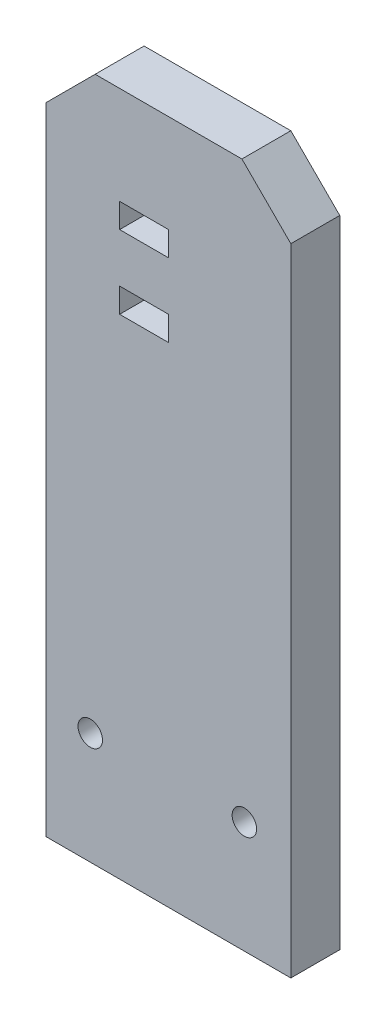
ISO-10303-21;
HEADER;
FILE_DESCRIPTION(('STEP AP214'),'2;1');
FILE_NAME('part.step','',(''),(''),'','','');
FILE_SCHEMA(('AUTOMOTIVE_DESIGN { 1 0 10303 214 1 1 1 1 }'));
ENDSEC;
DATA;
#1=APPLICATION_CONTEXT('core data for automotive mechanical design processes');
#2=APPLICATION_PROTOCOL_DEFINITION('international standard','automotive_design',2000,#1);
#3=PRODUCT_CONTEXT('',#1,'mechanical');
#4=PRODUCT('Part','Part','',(#3));
#5=PRODUCT_RELATED_PRODUCT_CATEGORY('part','',(#4));
#6=PRODUCT_DEFINITION_FORMATION('','',#4);
#7=PRODUCT_DEFINITION_CONTEXT('part definition',#1,'design');
#8=PRODUCT_DEFINITION('design','',#6,#7);
#9=PRODUCT_DEFINITION_SHAPE('','',#8);
#10=(LENGTH_UNIT() NAMED_UNIT(*) SI_UNIT(.MILLI.,.METRE.));
#11=(NAMED_UNIT(*) PLANE_ANGLE_UNIT() SI_UNIT($,.RADIAN.));
#12=(NAMED_UNIT(*) SI_UNIT($,.STERADIAN.) SOLID_ANGLE_UNIT());
#13=UNCERTAINTY_MEASURE_WITH_UNIT(LENGTH_MEASURE(1.E-05),#10,'distance_accuracy_value','');
#14=(GEOMETRIC_REPRESENTATION_CONTEXT(3) GLOBAL_UNCERTAINTY_ASSIGNED_CONTEXT((#13)) GLOBAL_UNIT_ASSIGNED_CONTEXT((#10,
#11,#12)) REPRESENTATION_CONTEXT('',''));
#15=CARTESIAN_POINT('',(0.,0.,0.));
#16=DIRECTION('',(0.,0.,1.));
#17=DIRECTION('',(1.,0.,0.));
#18=AXIS2_PLACEMENT_3D('',#15,#16,#17);
#19=CARTESIAN_POINT('',(0.,0.,5.));
#20=DIRECTION('',(0.,0.,1.));
#21=DIRECTION('',(1.,0.,0.));
#22=AXIS2_PLACEMENT_3D('',#19,#20,#21);
#23=PLANE('',#22);
#24=CARTESIAN_POINT('',(-16.,22.85,5.));
#25=DIRECTION('',(0.,0.,1.));
#26=DIRECTION('',(1.,0.,0.));
#27=AXIS2_PLACEMENT_3D('',#24,#25,#26);
#28=CIRCLE('',#27,2.5);
#29=CARTESIAN_POINT('',(-13.5,22.85,5.));
#30=VERTEX_POINT('',#29);
#31=EDGE_CURVE('E190',#30,#30,#28,.T.);
#32=ORIENTED_EDGE('',*,*,#31,.F.);
#33=EDGE_LOOP('',(#32));
#34=FACE_BOUND('',#33,.T.);
#35=DIRECTION('',(-1.,0.,0.));
#36=VECTOR('',#35,1.);
#37=CARTESIAN_POINT('',(-25.,140.,5.));
#38=LINE('',#37,#36);
#39=CARTESIAN_POINT('',(15.,140.,5.));
#40=VERTEX_POINT('',#39);
#41=CARTESIAN_POINT('',(-15.,140.,5.));
#42=VERTEX_POINT('',#41);
#43=EDGE_CURVE('E250',#40,#42,#38,.T.);
#44=ORIENTED_EDGE('',*,*,#43,.T.);
#45=DIRECTION('',(0.707106781186548,0.707106781186547,0.));
#46=VECTOR('',#45,1.);
#47=CARTESIAN_POINT('',(-77.5,77.5000000000001,5.));
#48=LINE('',#47,#46);
#49=CARTESIAN_POINT('',(-25.,130.,5.));
#50=VERTEX_POINT('',#49);
#51=EDGE_CURVE('E55',#42,#50,#48,.F.);
#52=ORIENTED_EDGE('',*,*,#51,.T.);
#53=DIRECTION('',(0.,-1.,0.));
#54=VECTOR('',#53,1.);
#55=CARTESIAN_POINT('',(-25.,0.,5.));
#56=LINE('',#55,#54);
#57=CARTESIAN_POINT('',(-25.,0.,5.));
#58=VERTEX_POINT('',#57);
#59=EDGE_CURVE('E253',#50,#58,#56,.T.);
#60=ORIENTED_EDGE('',*,*,#59,.T.);
#61=DIRECTION('',(1.,0.,0.));
#62=VECTOR('',#61,1.);
#63=CARTESIAN_POINT('',(25.,0.,5.));
#64=LINE('',#63,#62);
#65=CARTESIAN_POINT('',(25.,0.,5.));
#66=VERTEX_POINT('',#65);
#67=EDGE_CURVE('E257',#58,#66,#64,.T.);
#68=ORIENTED_EDGE('',*,*,#67,.T.);
#69=DIRECTION('',(0.,1.,0.));
#70=VECTOR('',#69,1.);
#71=CARTESIAN_POINT('',(25.,0.,5.));
#72=LINE('',#71,#70);
#73=CARTESIAN_POINT('',(25.,130.,5.));
#74=VERTEX_POINT('',#73);
#75=EDGE_CURVE('E260',#66,#74,#72,.T.);
#76=ORIENTED_EDGE('',*,*,#75,.T.);
#77=DIRECTION('',(0.707106781186547,-0.707106781186549,0.));
#78=VECTOR('',#77,1.);
#79=CARTESIAN_POINT('',(77.5,77.4999999999998,5.));
#80=LINE('',#79,#78);
#81=EDGE_CURVE('E297',#74,#40,#80,.F.);
#82=ORIENTED_EDGE('',*,*,#81,.T.);
#83=EDGE_LOOP('',(#44,#52,#60,#68,#76,#82));
#84=FACE_BOUND('',#83,.T.);
#85=DIRECTION('',(-1.,0.,0.));
#86=VECTOR('',#85,1.);
#87=CARTESIAN_POINT('',(0.,105.,5.));
#88=LINE('',#87,#86);
#89=CARTESIAN_POINT('',(0.,105.,5.));
#90=VERTEX_POINT('',#89);
#91=CARTESIAN_POINT('',(-10.,105.,5.));
#92=VERTEX_POINT('',#91);
#93=EDGE_CURVE('E210',#90,#92,#88,.T.);
#94=ORIENTED_EDGE('',*,*,#93,.F.);
#95=DIRECTION('',(0.,1.,0.));
#96=VECTOR('',#95,1.);
#97=CARTESIAN_POINT('',(0.,100.,5.));
#98=LINE('',#97,#96);
#99=CARTESIAN_POINT('',(0.,100.,5.));
#100=VERTEX_POINT('',#99);
#101=EDGE_CURVE('E207',#100,#90,#98,.T.);
#102=ORIENTED_EDGE('',*,*,#101,.F.);
#103=DIRECTION('',(1.,0.,0.));
#104=VECTOR('',#103,1.);
#105=CARTESIAN_POINT('',(0.,100.,5.));
#106=LINE('',#105,#104);
#107=CARTESIAN_POINT('',(-10.,100.,5.));
#108=VERTEX_POINT('',#107);
#109=EDGE_CURVE('E218',#108,#100,#106,.T.);
#110=ORIENTED_EDGE('',*,*,#109,.F.);
#111=DIRECTION('',(0.,-1.,0.));
#112=VECTOR('',#111,1.);
#113=CARTESIAN_POINT('',(-10.,100.,5.));
#114=LINE('',#113,#112);
#115=EDGE_CURVE('E214',#92,#108,#114,.T.);
#116=ORIENTED_EDGE('',*,*,#115,.F.);
#117=EDGE_LOOP('',(#94,#102,#110,#116));
#118=FACE_BOUND('',#117,.T.);
#119=DIRECTION('',(-1.,0.,0.));
#120=VECTOR('',#119,1.);
#121=CARTESIAN_POINT('',(0.,120.,5.));
#122=LINE('',#121,#120);
#123=CARTESIAN_POINT('',(0.,120.,5.));
#124=VERTEX_POINT('',#123);
#125=CARTESIAN_POINT('',(-10.,120.,5.));
#126=VERTEX_POINT('',#125);
#127=EDGE_CURVE('E162',#124,#126,#122,.T.);
#128=ORIENTED_EDGE('',*,*,#127,.F.);
#129=DIRECTION('',(0.,1.,0.));
#130=VECTOR('',#129,1.);
#131=CARTESIAN_POINT('',(0.,115.,5.));
#132=LINE('',#131,#130);
#133=CARTESIAN_POINT('',(0.,115.,5.));
#134=VERTEX_POINT('',#133);
#135=EDGE_CURVE('E151',#134,#124,#132,.T.);
#136=ORIENTED_EDGE('',*,*,#135,.F.);
#137=DIRECTION('',(1.,0.,0.));
#138=VECTOR('',#137,1.);
#139=CARTESIAN_POINT('',(0.,115.,5.));
#140=LINE('',#139,#138);
#141=CARTESIAN_POINT('',(-10.,115.,5.));
#142=VERTEX_POINT('',#141);
#143=EDGE_CURVE('E181',#142,#134,#140,.T.);
#144=ORIENTED_EDGE('',*,*,#143,.F.);
#145=DIRECTION('',(0.,-1.,0.));
#146=VECTOR('',#145,1.);
#147=CARTESIAN_POINT('',(-10.,115.,5.));
#148=LINE('',#147,#146);
#149=EDGE_CURVE('E177',#126,#142,#148,.T.);
#150=ORIENTED_EDGE('',*,*,#149,.F.);
#151=EDGE_LOOP('',(#128,#136,#144,#150));
#152=FACE_BOUND('',#151,.T.);
#153=CARTESIAN_POINT('',(15.5,22.85,5.));
#154=DIRECTION('',(0.,0.,1.));
#155=DIRECTION('',(1.,0.,0.));
#156=AXIS2_PLACEMENT_3D('',#153,#154,#155);
#157=CIRCLE('',#156,2.5);
#158=CARTESIAN_POINT('',(18.,22.85,5.));
#159=VERTEX_POINT('',#158);
#160=EDGE_CURVE('E385',#159,#159,#157,.T.);
#161=ORIENTED_EDGE('',*,*,#160,.F.);
#162=EDGE_LOOP('',(#161));
#163=FACE_BOUND('',#162,.T.);
#164=ADVANCED_FACE('F45',(#34,#84,#118,#152,#163),#23,.T.);
#165=CARTESIAN_POINT('',(0.,0.,-5.));
#166=DIRECTION('',(0.,0.,1.));
#167=DIRECTION('',(1.,0.,0.));
#168=AXIS2_PLACEMENT_3D('',#165,#166,#167);
#169=PLANE('',#168);
#170=DIRECTION('',(0.,1.,0.));
#171=VECTOR('',#170,1.);
#172=CARTESIAN_POINT('',(0.,100.,-5.));
#173=LINE('',#172,#171);
#174=CARTESIAN_POINT('',(0.,100.,-5.));
#175=VERTEX_POINT('',#174);
#176=CARTESIAN_POINT('',(0.,105.,-5.));
#177=VERTEX_POINT('',#176);
#178=EDGE_CURVE('E171',#175,#177,#173,.T.);
#179=ORIENTED_EDGE('',*,*,#178,.T.);
#180=DIRECTION('',(-1.,0.,0.));
#181=VECTOR('',#180,1.);
#182=CARTESIAN_POINT('',(0.,105.,-5.));
#183=LINE('',#182,#181);
#184=CARTESIAN_POINT('',(-10.,105.,-5.));
#185=VERTEX_POINT('',#184);
#186=EDGE_CURVE('E225',#177,#185,#183,.T.);
#187=ORIENTED_EDGE('',*,*,#186,.T.);
#188=DIRECTION('',(0.,-1.,0.));
#189=VECTOR('',#188,1.);
#190=CARTESIAN_POINT('',(-10.,100.,-5.));
#191=LINE('',#190,#189);
#192=CARTESIAN_POINT('',(-10.,100.,-5.));
#193=VERTEX_POINT('',#192);
#194=EDGE_CURVE('E229',#185,#193,#191,.T.);
#195=ORIENTED_EDGE('',*,*,#194,.T.);
#196=DIRECTION('',(1.,0.,0.));
#197=VECTOR('',#196,1.);
#198=CARTESIAN_POINT('',(0.,100.,-5.));
#199=LINE('',#198,#197);
#200=EDGE_CURVE('E211',#193,#175,#199,.T.);
#201=ORIENTED_EDGE('',*,*,#200,.T.);
#202=EDGE_LOOP('',(#179,#187,#195,#201));
#203=FACE_BOUND('',#202,.T.);
#204=DIRECTION('',(0.,-1.,0.));
#205=VECTOR('',#204,1.);
#206=CARTESIAN_POINT('',(-25.,0.,-5.));
#207=LINE('',#206,#205);
#208=CARTESIAN_POINT('',(-25.,130.,-5.));
#209=VERTEX_POINT('',#208);
#210=CARTESIAN_POINT('',(-25.,0.,-5.));
#211=VERTEX_POINT('',#210);
#212=EDGE_CURVE('E266',#209,#211,#207,.T.);
#213=ORIENTED_EDGE('',*,*,#212,.F.);
#214=DIRECTION('',(-0.707106781186548,-0.707106781186547,0.));
#215=VECTOR('',#214,1.);
#216=CARTESIAN_POINT('',(-25.,130.,-5.));
#217=LINE('',#216,#215);
#218=CARTESIAN_POINT('',(-15.,140.,-5.));
#219=VERTEX_POINT('',#218);
#220=EDGE_CURVE('E288',#209,#219,#217,.F.);
#221=ORIENTED_EDGE('',*,*,#220,.T.);
#222=DIRECTION('',(-1.,0.,0.));
#223=VECTOR('',#222,1.);
#224=CARTESIAN_POINT('',(-25.,140.,-5.));
#225=LINE('',#224,#223);
#226=CARTESIAN_POINT('',(15.,140.,-5.));
#227=VERTEX_POINT('',#226);
#228=EDGE_CURVE('E249',#227,#219,#225,.T.);
#229=ORIENTED_EDGE('',*,*,#228,.F.);
#230=DIRECTION('',(-0.707106781186547,0.707106781186549,0.));
#231=VECTOR('',#230,1.);
#232=CARTESIAN_POINT('',(15.,140.,-5.));
#233=LINE('',#232,#231);
#234=CARTESIAN_POINT('',(25.,130.,-5.));
#235=VERTEX_POINT('',#234);
#236=EDGE_CURVE('E285',#227,#235,#233,.F.);
#237=ORIENTED_EDGE('',*,*,#236,.T.);
#238=DIRECTION('',(0.,1.,0.));
#239=VECTOR('',#238,1.);
#240=CARTESIAN_POINT('',(25.,0.,-5.));
#241=LINE('',#240,#239);
#242=CARTESIAN_POINT('',(25.,0.,-5.));
#243=VERTEX_POINT('',#242);
#244=EDGE_CURVE('E254',#243,#235,#241,.T.);
#245=ORIENTED_EDGE('',*,*,#244,.F.);
#246=DIRECTION('',(1.,0.,0.));
#247=VECTOR('',#246,1.);
#248=CARTESIAN_POINT('',(25.,0.,-5.));
#249=LINE('',#248,#247);
#250=EDGE_CURVE('E269',#211,#243,#249,.T.);
#251=ORIENTED_EDGE('',*,*,#250,.F.);
#252=EDGE_LOOP('',(#213,#221,#229,#237,#245,#251));
#253=FACE_BOUND('',#252,.T.);
#254=DIRECTION('',(0.,1.,0.));
#255=VECTOR('',#254,1.);
#256=CARTESIAN_POINT('',(0.,115.,-5.));
#257=LINE('',#256,#255);
#258=CARTESIAN_POINT('',(0.,115.,-5.));
#259=VERTEX_POINT('',#258);
#260=CARTESIAN_POINT('',(0.,120.,-5.));
#261=VERTEX_POINT('',#260);
#262=EDGE_CURVE('E187',#259,#261,#257,.T.);
#263=ORIENTED_EDGE('',*,*,#262,.T.);
#264=DIRECTION('',(-1.,0.,0.));
#265=VECTOR('',#264,1.);
#266=CARTESIAN_POINT('',(0.,120.,-5.));
#267=LINE('',#266,#265);
#268=CARTESIAN_POINT('',(-10.,120.,-5.));
#269=VERTEX_POINT('',#268);
#270=EDGE_CURVE('E169',#261,#269,#267,.T.);
#271=ORIENTED_EDGE('',*,*,#270,.T.);
#272=DIRECTION('',(0.,-1.,0.));
#273=VECTOR('',#272,1.);
#274=CARTESIAN_POINT('',(-10.,115.,-5.));
#275=LINE('',#274,#273);
#276=CARTESIAN_POINT('',(-10.,115.,-5.));
#277=VERTEX_POINT('',#276);
#278=EDGE_CURVE('E193',#269,#277,#275,.T.);
#279=ORIENTED_EDGE('',*,*,#278,.T.);
#280=DIRECTION('',(1.,0.,0.));
#281=VECTOR('',#280,1.);
#282=CARTESIAN_POINT('',(0.,115.,-5.));
#283=LINE('',#282,#281);
#284=EDGE_CURVE('E163',#277,#259,#283,.T.);
#285=ORIENTED_EDGE('',*,*,#284,.T.);
#286=EDGE_LOOP('',(#263,#271,#279,#285));
#287=FACE_BOUND('',#286,.T.);
#288=CARTESIAN_POINT('',(-16.,22.85,-5.));
#289=DIRECTION('',(0.,0.,1.));
#290=DIRECTION('',(1.,0.,0.));
#291=AXIS2_PLACEMENT_3D('',#288,#289,#290);
#292=CIRCLE('',#291,2.5);
#293=CARTESIAN_POINT('',(-13.5,22.85,-5.));
#294=VERTEX_POINT('',#293);
#295=EDGE_CURVE('E393',#294,#294,#292,.T.);
#296=ORIENTED_EDGE('',*,*,#295,.T.);
#297=EDGE_LOOP('',(#296));
#298=FACE_BOUND('',#297,.T.);
#299=CARTESIAN_POINT('',(15.5,22.85,-5.));
#300=DIRECTION('',(0.,0.,1.));
#301=DIRECTION('',(1.,0.,0.));
#302=AXIS2_PLACEMENT_3D('',#299,#300,#301);
#303=CIRCLE('',#302,2.5);
#304=CARTESIAN_POINT('',(18.,22.85,-5.));
#305=VERTEX_POINT('',#304);
#306=EDGE_CURVE('E388',#305,#305,#303,.T.);
#307=ORIENTED_EDGE('',*,*,#306,.T.);
#308=EDGE_LOOP('',(#307));
#309=FACE_BOUND('',#308,.T.);
#310=ADVANCED_FACE('F314',(#203,#253,#287,#298,#309),#169,.F.);
#311=CARTESIAN_POINT('',(-25.,140.,5.));
#312=DIRECTION('',(0.,-1.,0.));
#313=DIRECTION('',(0.,0.,-1.));
#314=AXIS2_PLACEMENT_3D('',#311,#312,#313);
#315=PLANE('',#314);
#316=ORIENTED_EDGE('',*,*,#228,.T.);
#317=DIRECTION('',(0.,0.,1.));
#318=VECTOR('',#317,1.);
#319=CARTESIAN_POINT('',(-15.,140.,5.));
#320=LINE('',#319,#318);
#321=EDGE_CURVE('E68',#219,#42,#320,.T.);
#322=ORIENTED_EDGE('',*,*,#321,.T.);
#323=ORIENTED_EDGE('',*,*,#43,.F.);
#324=DIRECTION('',(0.,0.,-1.));
#325=VECTOR('',#324,1.);
#326=CARTESIAN_POINT('',(15.,140.,5.));
#327=LINE('',#326,#325);
#328=EDGE_CURVE('E291',#40,#227,#327,.T.);
#329=ORIENTED_EDGE('',*,*,#328,.T.);
#330=EDGE_LOOP('',(#316,#322,#323,#329));
#331=FACE_BOUND('',#330,.T.);
#332=ADVANCED_FACE('F317',(#331),#315,.F.);
#333=CARTESIAN_POINT('',(-25.,0.,5.));
#334=DIRECTION('',(1.,0.,0.));
#335=DIRECTION('',(0.,0.,-1.));
#336=AXIS2_PLACEMENT_3D('',#333,#334,#335);
#337=PLANE('',#336);
#338=ORIENTED_EDGE('',*,*,#59,.F.);
#339=DIRECTION('',(0.,0.,-1.));
#340=VECTOR('',#339,1.);
#341=CARTESIAN_POINT('',(-25.,130.,5.));
#342=LINE('',#341,#340);
#343=EDGE_CURVE('E281',#50,#209,#342,.T.);
#344=ORIENTED_EDGE('',*,*,#343,.T.);
#345=ORIENTED_EDGE('',*,*,#212,.T.);
#346=DIRECTION('',(0.,0.,-1.));
#347=VECTOR('',#346,1.);
#348=CARTESIAN_POINT('',(-25.,0.,5.));
#349=LINE('',#348,#347);
#350=EDGE_CURVE('E277',#58,#211,#349,.T.);
#351=ORIENTED_EDGE('',*,*,#350,.F.);
#352=EDGE_LOOP('',(#338,#344,#345,#351));
#353=FACE_BOUND('',#352,.T.);
#354=ADVANCED_FACE('F308',(#353),#337,.F.);
#355=CARTESIAN_POINT('',(25.,0.,5.));
#356=DIRECTION('',(0.,1.,0.));
#357=DIRECTION('',(0.,0.,1.));
#358=AXIS2_PLACEMENT_3D('',#355,#356,#357);
#359=PLANE('',#358);
#360=ORIENTED_EDGE('',*,*,#250,.T.);
#361=DIRECTION('',(0.,0.,-1.));
#362=VECTOR('',#361,1.);
#363=CARTESIAN_POINT('',(25.,0.,5.));
#364=LINE('',#363,#362);
#365=EDGE_CURVE('E263',#66,#243,#364,.T.);
#366=ORIENTED_EDGE('',*,*,#365,.F.);
#367=ORIENTED_EDGE('',*,*,#67,.F.);
#368=ORIENTED_EDGE('',*,*,#350,.T.);
#369=EDGE_LOOP('',(#360,#366,#367,#368));
#370=FACE_BOUND('',#369,.T.);
#371=ADVANCED_FACE('F325',(#370),#359,.F.);
#372=CARTESIAN_POINT('',(25.,0.,5.));
#373=DIRECTION('',(-1.,0.,0.));
#374=DIRECTION('',(0.,0.,1.));
#375=AXIS2_PLACEMENT_3D('',#372,#373,#374);
#376=PLANE('',#375);
#377=ORIENTED_EDGE('',*,*,#244,.T.);
#378=DIRECTION('',(0.,0.,1.));
#379=VECTOR('',#378,1.);
#380=CARTESIAN_POINT('',(25.,130.,5.));
#381=LINE('',#380,#379);
#382=EDGE_CURVE('E11',#235,#74,#381,.T.);
#383=ORIENTED_EDGE('',*,*,#382,.T.);
#384=ORIENTED_EDGE('',*,*,#75,.F.);
#385=ORIENTED_EDGE('',*,*,#365,.T.);
#386=EDGE_LOOP('',(#377,#383,#384,#385));
#387=FACE_BOUND('',#386,.T.);
#388=ADVANCED_FACE('F322',(#387),#376,.F.);
#389=CARTESIAN_POINT('',(0.,100.,5.));
#390=DIRECTION('',(-1.,0.,0.));
#391=DIRECTION('',(0.,0.,1.));
#392=AXIS2_PLACEMENT_3D('',#389,#390,#391);
#393=PLANE('',#392);
#394=ORIENTED_EDGE('',*,*,#178,.F.);
#395=DIRECTION('',(0.,0.,-1.));
#396=VECTOR('',#395,1.);
#397=CARTESIAN_POINT('',(0.,100.,5.));
#398=LINE('',#397,#396);
#399=EDGE_CURVE('E221',#100,#175,#398,.T.);
#400=ORIENTED_EDGE('',*,*,#399,.F.);
#401=ORIENTED_EDGE('',*,*,#101,.T.);
#402=DIRECTION('',(0.,0.,-1.));
#403=VECTOR('',#402,1.);
#404=CARTESIAN_POINT('',(0.,105.,5.));
#405=LINE('',#404,#403);
#406=EDGE_CURVE('E245',#90,#177,#405,.T.);
#407=ORIENTED_EDGE('',*,*,#406,.T.);
#408=EDGE_LOOP('',(#394,#400,#401,#407));
#409=FACE_BOUND('',#408,.T.);
#410=ADVANCED_FACE('F332',(#409),#393,.T.);
#411=CARTESIAN_POINT('',(0.,105.,5.));
#412=DIRECTION('',(0.,-1.,0.));
#413=DIRECTION('',(0.,0.,-1.));
#414=AXIS2_PLACEMENT_3D('',#411,#412,#413);
#415=PLANE('',#414);
#416=ORIENTED_EDGE('',*,*,#186,.F.);
#417=ORIENTED_EDGE('',*,*,#406,.F.);
#418=ORIENTED_EDGE('',*,*,#93,.T.);
#419=DIRECTION('',(0.,0.,-1.));
#420=VECTOR('',#419,1.);
#421=CARTESIAN_POINT('',(-10.,105.,5.));
#422=LINE('',#421,#420);
#423=EDGE_CURVE('E242',#92,#185,#422,.T.);
#424=ORIENTED_EDGE('',*,*,#423,.T.);
#425=EDGE_LOOP('',(#416,#417,#418,#424));
#426=FACE_BOUND('',#425,.T.);
#427=ADVANCED_FACE('F347',(#426),#415,.T.);
#428=CARTESIAN_POINT('',(-10.,100.,5.));
#429=DIRECTION('',(1.,0.,0.));
#430=DIRECTION('',(0.,0.,-1.));
#431=AXIS2_PLACEMENT_3D('',#428,#429,#430);
#432=PLANE('',#431);
#433=ORIENTED_EDGE('',*,*,#194,.F.);
#434=ORIENTED_EDGE('',*,*,#423,.F.);
#435=ORIENTED_EDGE('',*,*,#115,.T.);
#436=DIRECTION('',(0.,0.,-1.));
#437=VECTOR('',#436,1.);
#438=CARTESIAN_POINT('',(-10.,100.,5.));
#439=LINE('',#438,#437);
#440=EDGE_CURVE('E239',#108,#193,#439,.T.);
#441=ORIENTED_EDGE('',*,*,#440,.T.);
#442=EDGE_LOOP('',(#433,#434,#435,#441));
#443=FACE_BOUND('',#442,.T.);
#444=ADVANCED_FACE('F351',(#443),#432,.T.);
#445=CARTESIAN_POINT('',(0.,100.,5.));
#446=DIRECTION('',(0.,1.,0.));
#447=DIRECTION('',(0.,0.,1.));
#448=AXIS2_PLACEMENT_3D('',#445,#446,#447);
#449=PLANE('',#448);
#450=ORIENTED_EDGE('',*,*,#200,.F.);
#451=ORIENTED_EDGE('',*,*,#440,.F.);
#452=ORIENTED_EDGE('',*,*,#109,.T.);
#453=ORIENTED_EDGE('',*,*,#399,.T.);
#454=EDGE_LOOP('',(#450,#451,#452,#453));
#455=FACE_BOUND('',#454,.T.);
#456=ADVANCED_FACE('F355',(#455),#449,.T.);
#457=CARTESIAN_POINT('',(0.,115.,5.));
#458=DIRECTION('',(-1.,0.,0.));
#459=DIRECTION('',(0.,0.,1.));
#460=AXIS2_PLACEMENT_3D('',#457,#458,#459);
#461=PLANE('',#460);
#462=ORIENTED_EDGE('',*,*,#262,.F.);
#463=DIRECTION('',(0.,0.,-1.));
#464=VECTOR('',#463,1.);
#465=CARTESIAN_POINT('',(0.,115.,5.));
#466=LINE('',#465,#464);
#467=EDGE_CURVE('E157',#134,#259,#466,.T.);
#468=ORIENTED_EDGE('',*,*,#467,.F.);
#469=ORIENTED_EDGE('',*,*,#135,.T.);
#470=DIRECTION('',(0.,0.,-1.));
#471=VECTOR('',#470,1.);
#472=CARTESIAN_POINT('',(0.,120.,5.));
#473=LINE('',#472,#471);
#474=EDGE_CURVE('E154',#124,#261,#473,.T.);
#475=ORIENTED_EDGE('',*,*,#474,.T.);
#476=EDGE_LOOP('',(#462,#468,#469,#475));
#477=FACE_BOUND('',#476,.T.);
#478=ADVANCED_FACE('F153',(#477),#461,.T.);
#479=CARTESIAN_POINT('',(0.,120.,5.));
#480=DIRECTION('',(0.,-1.,0.));
#481=DIRECTION('',(0.,0.,-1.));
#482=AXIS2_PLACEMENT_3D('',#479,#480,#481);
#483=PLANE('',#482);
#484=ORIENTED_EDGE('',*,*,#270,.F.);
#485=ORIENTED_EDGE('',*,*,#474,.F.);
#486=ORIENTED_EDGE('',*,*,#127,.T.);
#487=DIRECTION('',(0.,0.,-1.));
#488=VECTOR('',#487,1.);
#489=CARTESIAN_POINT('',(-10.,120.,5.));
#490=LINE('',#489,#488);
#491=EDGE_CURVE('E172',#126,#269,#490,.T.);
#492=ORIENTED_EDGE('',*,*,#491,.T.);
#493=EDGE_LOOP('',(#484,#485,#486,#492));
#494=FACE_BOUND('',#493,.T.);
#495=ADVANCED_FACE('F166',(#494),#483,.T.);
#496=CARTESIAN_POINT('',(-10.,115.,5.));
#497=DIRECTION('',(1.,0.,0.));
#498=DIRECTION('',(0.,0.,-1.));
#499=AXIS2_PLACEMENT_3D('',#496,#497,#498);
#500=PLANE('',#499);
#501=ORIENTED_EDGE('',*,*,#278,.F.);
#502=ORIENTED_EDGE('',*,*,#491,.F.);
#503=ORIENTED_EDGE('',*,*,#149,.T.);
#504=DIRECTION('',(0.,0.,-1.));
#505=VECTOR('',#504,1.);
#506=CARTESIAN_POINT('',(-10.,115.,5.));
#507=LINE('',#506,#505);
#508=EDGE_CURVE('E202',#142,#277,#507,.T.);
#509=ORIENTED_EDGE('',*,*,#508,.T.);
#510=EDGE_LOOP('',(#501,#502,#503,#509));
#511=FACE_BOUND('',#510,.T.);
#512=ADVANCED_FACE('F364',(#511),#500,.T.);
#513=CARTESIAN_POINT('',(0.,115.,5.));
#514=DIRECTION('',(0.,1.,0.));
#515=DIRECTION('',(0.,0.,1.));
#516=AXIS2_PLACEMENT_3D('',#513,#514,#515);
#517=PLANE('',#516);
#518=ORIENTED_EDGE('',*,*,#284,.F.);
#519=ORIENTED_EDGE('',*,*,#508,.F.);
#520=ORIENTED_EDGE('',*,*,#143,.T.);
#521=ORIENTED_EDGE('',*,*,#467,.T.);
#522=EDGE_LOOP('',(#518,#519,#520,#521));
#523=FACE_BOUND('',#522,.T.);
#524=ADVANCED_FACE('F367',(#523),#517,.T.);
#525=CARTESIAN_POINT('',(-16.,22.85,5.));
#526=DIRECTION('',(0.,0.,-1.));
#527=DIRECTION('',(-1.,0.,0.));
#528=AXIS2_PLACEMENT_3D('',#525,#526,#527);
#529=CYLINDRICAL_SURFACE('',#528,2.5);
#530=ORIENTED_EDGE('',*,*,#31,.T.);
#531=EDGE_LOOP('',(#530));
#532=FACE_BOUND('',#531,.T.);
#533=ORIENTED_EDGE('',*,*,#295,.F.);
#534=EDGE_LOOP('',(#533));
#535=FACE_BOUND('',#534,.T.);
#536=ADVANCED_FACE('F371',(#532,#535),#529,.F.);
#537=CARTESIAN_POINT('',(15.5,22.85,5.));
#538=DIRECTION('',(0.,0.,-1.));
#539=DIRECTION('',(-1.,0.,0.));
#540=AXIS2_PLACEMENT_3D('',#537,#538,#539);
#541=CYLINDRICAL_SURFACE('',#540,2.5);
#542=ORIENTED_EDGE('',*,*,#160,.T.);
#543=EDGE_LOOP('',(#542));
#544=FACE_BOUND('',#543,.T.);
#545=ORIENTED_EDGE('',*,*,#306,.F.);
#546=EDGE_LOOP('',(#545));
#547=FACE_BOUND('',#546,.T.);
#548=ADVANCED_FACE('F375',(#544,#547),#541,.F.);
#549=CARTESIAN_POINT('',(-25.,130.,5.));
#550=DIRECTION('',(0.707106781186547,-0.707106781186548,0.));
#551=DIRECTION('',(0.,0.,-1.));
#552=AXIS2_PLACEMENT_3D('',#549,#550,#551);
#553=PLANE('',#552);
#554=ORIENTED_EDGE('',*,*,#51,.F.);
#555=ORIENTED_EDGE('',*,*,#321,.F.);
#556=ORIENTED_EDGE('',*,*,#220,.F.);
#557=ORIENTED_EDGE('',*,*,#343,.F.);
#558=EDGE_LOOP('',(#554,#555,#556,#557));
#559=FACE_BOUND('',#558,.T.);
#560=ADVANCED_FACE('F311',(#559),#553,.F.);
#561=CARTESIAN_POINT('',(15.,140.,5.));
#562=DIRECTION('',(-0.707106781186548,-0.707106781186546,0.));
#563=DIRECTION('',(0.,0.,-1.));
#564=AXIS2_PLACEMENT_3D('',#561,#562,#563);
#565=PLANE('',#564);
#566=ORIENTED_EDGE('',*,*,#81,.F.);
#567=ORIENTED_EDGE('',*,*,#382,.F.);
#568=ORIENTED_EDGE('',*,*,#236,.F.);
#569=ORIENTED_EDGE('',*,*,#328,.F.);
#570=EDGE_LOOP('',(#566,#567,#568,#569));
#571=FACE_BOUND('',#570,.T.);
#572=ADVANCED_FACE('F48',(#571),#565,.F.);
#573=CLOSED_SHELL('',(#164,#310,#332,#354,#371,#388,#410,#427,#444,#456,#478,#495,#512,#524,
#536,#548,#560,#572));
#574=MANIFOLD_SOLID_BREP('B2',#573);
#575=ADVANCED_BREP_SHAPE_REPRESENTATION('',(#18,#574),#14);
#576=SHAPE_DEFINITION_REPRESENTATION(#9,#575);
ENDSEC;
END-ISO-10303-21;
